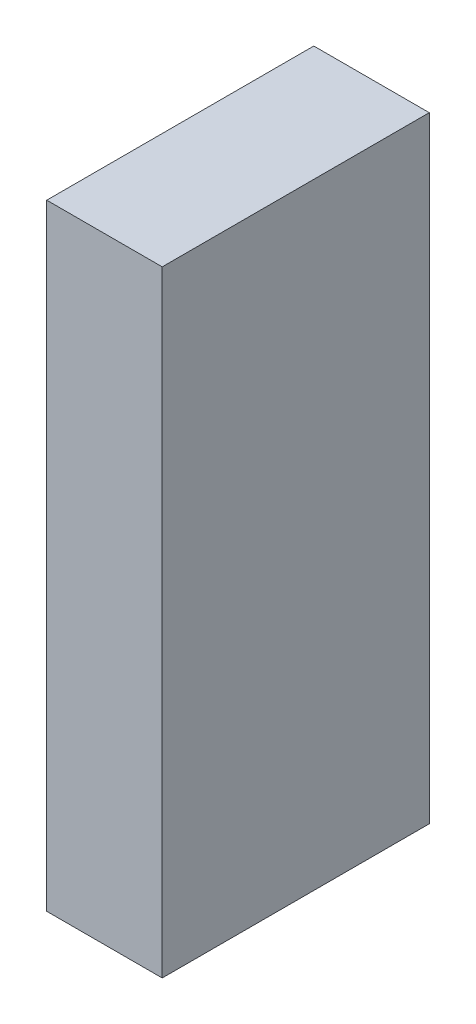
ISO-10303-21;
HEADER;
FILE_DESCRIPTION(('STEP AP214'),'2;1');
FILE_NAME('part.step','',(''),(''),'','','');
FILE_SCHEMA(('AUTOMOTIVE_DESIGN { 1 0 10303 214 1 1 1 1 }'));
ENDSEC;
DATA;
#1=APPLICATION_CONTEXT('core data for automotive mechanical design processes');
#2=APPLICATION_PROTOCOL_DEFINITION('international standard','automotive_design',2000,#1);
#3=PRODUCT_CONTEXT('',#1,'mechanical');
#4=PRODUCT('Part','Part','',(#3));
#5=PRODUCT_RELATED_PRODUCT_CATEGORY('part','',(#4));
#6=PRODUCT_DEFINITION_FORMATION('','',#4);
#7=PRODUCT_DEFINITION_CONTEXT('part definition',#1,'design');
#8=PRODUCT_DEFINITION('design','',#6,#7);
#9=PRODUCT_DEFINITION_SHAPE('','',#8);
#10=(LENGTH_UNIT() NAMED_UNIT(*) SI_UNIT(.MILLI.,.METRE.));
#11=(NAMED_UNIT(*) PLANE_ANGLE_UNIT() SI_UNIT($,.RADIAN.));
#12=(NAMED_UNIT(*) SI_UNIT($,.STERADIAN.) SOLID_ANGLE_UNIT());
#13=UNCERTAINTY_MEASURE_WITH_UNIT(LENGTH_MEASURE(1.E-05),#10,'distance_accuracy_value','');
#14=(GEOMETRIC_REPRESENTATION_CONTEXT(3) GLOBAL_UNCERTAINTY_ASSIGNED_CONTEXT((#13)) GLOBAL_UNIT_ASSIGNED_CONTEXT((#10,
#11,#12)) REPRESENTATION_CONTEXT('',''));
#15=CARTESIAN_POINT('',(0.,0.,0.));
#16=DIRECTION('',(0.,0.,1.));
#17=DIRECTION('',(1.,0.,0.));
#18=AXIS2_PLACEMENT_3D('',#15,#16,#17);
#19=CARTESIAN_POINT('',(-19.05,203.2,44.053125));
#20=DIRECTION('',(1.,0.,0.));
#21=DIRECTION('',(0.,0.,-1.));
#22=AXIS2_PLACEMENT_3D('',#19,#20,#21);
#23=PLANE('',#22);
#24=DIRECTION('',(0.,0.,1.));
#25=VECTOR('',#24,1.);
#26=CARTESIAN_POINT('',(-19.05,0.,44.053125));
#27=LINE('',#26,#25);
#28=CARTESIAN_POINT('',(-19.05,0.,-44.053125));
#29=VERTEX_POINT('',#28);
#30=CARTESIAN_POINT('',(-19.05,0.,44.053125));
#31=VERTEX_POINT('',#30);
#32=EDGE_CURVE('E107',#29,#31,#27,.T.);
#33=ORIENTED_EDGE('',*,*,#32,.T.);
#34=DIRECTION('',(0.,-1.,0.));
#35=VECTOR('',#34,1.);
#36=CARTESIAN_POINT('',(-19.05,203.2,44.053125));
#37=LINE('',#36,#35);
#38=CARTESIAN_POINT('',(-19.05,203.2,44.053125));
#39=VERTEX_POINT('',#38);
#40=EDGE_CURVE('E11',#39,#31,#37,.T.);
#41=ORIENTED_EDGE('',*,*,#40,.F.);
#42=DIRECTION('',(0.,0.,1.));
#43=VECTOR('',#42,1.);
#44=CARTESIAN_POINT('',(-19.05,203.2,44.053125));
#45=LINE('',#44,#43);
#46=CARTESIAN_POINT('',(-19.05,203.2,-44.053125));
#47=VERTEX_POINT('',#46);
#48=EDGE_CURVE('E91',#47,#39,#45,.T.);
#49=ORIENTED_EDGE('',*,*,#48,.F.);
#50=DIRECTION('',(0.,-1.,0.));
#51=VECTOR('',#50,1.);
#52=CARTESIAN_POINT('',(-19.05,203.2,-44.053125));
#53=LINE('',#52,#51);
#54=EDGE_CURVE('E103',#47,#29,#53,.T.);
#55=ORIENTED_EDGE('',*,*,#54,.T.);
#56=EDGE_LOOP('',(#33,#41,#49,#55));
#57=FACE_BOUND('',#56,.T.);
#58=ADVANCED_FACE('F39',(#57),#23,.F.);
#59=CARTESIAN_POINT('',(19.05,203.2,44.053125));
#60=DIRECTION('',(0.,0.,-1.));
#61=DIRECTION('',(-1.,0.,0.));
#62=AXIS2_PLACEMENT_3D('',#59,#60,#61);
#63=PLANE('',#62);
#64=DIRECTION('',(1.,0.,0.));
#65=VECTOR('',#64,1.);
#66=CARTESIAN_POINT('',(19.05,0.,44.053125));
#67=LINE('',#66,#65);
#68=CARTESIAN_POINT('',(19.05,0.,44.053125));
#69=VERTEX_POINT('',#68);
#70=EDGE_CURVE('E96',#31,#69,#67,.T.);
#71=ORIENTED_EDGE('',*,*,#70,.T.);
#72=DIRECTION('',(0.,-1.,0.));
#73=VECTOR('',#72,1.);
#74=CARTESIAN_POINT('',(19.05,203.2,44.053125));
#75=LINE('',#74,#73);
#76=CARTESIAN_POINT('',(19.05,203.2,44.053125));
#77=VERTEX_POINT('',#76);
#78=EDGE_CURVE('E48',#77,#69,#75,.T.);
#79=ORIENTED_EDGE('',*,*,#78,.F.);
#80=DIRECTION('',(1.,0.,0.));
#81=VECTOR('',#80,1.);
#82=CARTESIAN_POINT('',(19.05,203.2,44.053125));
#83=LINE('',#82,#81);
#84=EDGE_CURVE('E86',#39,#77,#83,.T.);
#85=ORIENTED_EDGE('',*,*,#84,.F.);
#86=ORIENTED_EDGE('',*,*,#40,.T.);
#87=EDGE_LOOP('',(#71,#79,#85,#86));
#88=FACE_BOUND('',#87,.T.);
#89=ADVANCED_FACE('F95',(#88),#63,.F.);
#90=CARTESIAN_POINT('',(19.05,203.2,44.053125));
#91=DIRECTION('',(-1.,0.,0.));
#92=DIRECTION('',(0.,0.,1.));
#93=AXIS2_PLACEMENT_3D('',#90,#91,#92);
#94=PLANE('',#93);
#95=DIRECTION('',(0.,0.,-1.));
#96=VECTOR('',#95,1.);
#97=CARTESIAN_POINT('',(19.05,0.,44.053125));
#98=LINE('',#97,#96);
#99=CARTESIAN_POINT('',(19.05,0.,-44.053125));
#100=VERTEX_POINT('',#99);
#101=EDGE_CURVE('E73',#69,#100,#98,.T.);
#102=ORIENTED_EDGE('',*,*,#101,.T.);
#103=DIRECTION('',(0.,-1.,0.));
#104=VECTOR('',#103,1.);
#105=CARTESIAN_POINT('',(19.05,203.2,-44.053125));
#106=LINE('',#105,#104);
#107=CARTESIAN_POINT('',(19.05,203.2,-44.053125));
#108=VERTEX_POINT('',#107);
#109=EDGE_CURVE('E98',#108,#100,#106,.T.);
#110=ORIENTED_EDGE('',*,*,#109,.F.);
#111=DIRECTION('',(0.,0.,-1.));
#112=VECTOR('',#111,1.);
#113=CARTESIAN_POINT('',(19.05,203.2,44.053125));
#114=LINE('',#113,#112);
#115=EDGE_CURVE('E89',#77,#108,#114,.T.);
#116=ORIENTED_EDGE('',*,*,#115,.F.);
#117=ORIENTED_EDGE('',*,*,#78,.T.);
#118=EDGE_LOOP('',(#102,#110,#116,#117));
#119=FACE_BOUND('',#118,.T.);
#120=ADVANCED_FACE('F99',(#119),#94,.F.);
#121=CARTESIAN_POINT('',(19.05,203.2,-44.053125));
#122=DIRECTION('',(0.,0.,1.));
#123=DIRECTION('',(1.,0.,0.));
#124=AXIS2_PLACEMENT_3D('',#121,#122,#123);
#125=PLANE('',#124);
#126=DIRECTION('',(-1.,0.,0.));
#127=VECTOR('',#126,1.);
#128=CARTESIAN_POINT('',(19.05,0.,-44.053125));
#129=LINE('',#128,#127);
#130=EDGE_CURVE('E79',#100,#29,#129,.T.);
#131=ORIENTED_EDGE('',*,*,#130,.T.);
#132=ORIENTED_EDGE('',*,*,#54,.F.);
#133=DIRECTION('',(-1.,0.,0.));
#134=VECTOR('',#133,1.);
#135=CARTESIAN_POINT('',(19.05,203.2,-44.053125));
#136=LINE('',#135,#134);
#137=EDGE_CURVE('E56',#108,#47,#136,.T.);
#138=ORIENTED_EDGE('',*,*,#137,.F.);
#139=ORIENTED_EDGE('',*,*,#109,.T.);
#140=EDGE_LOOP('',(#131,#132,#138,#139));
#141=FACE_BOUND('',#140,.T.);
#142=ADVANCED_FACE('F120',(#141),#125,.F.);
#143=CARTESIAN_POINT('',(0.,203.2,0.));
#144=DIRECTION('',(0.,1.,0.));
#145=DIRECTION('',(0.,0.,1.));
#146=AXIS2_PLACEMENT_3D('',#143,#144,#145);
#147=PLANE('',#146);
#148=ORIENTED_EDGE('',*,*,#48,.T.);
#149=ORIENTED_EDGE('',*,*,#84,.T.);
#150=ORIENTED_EDGE('',*,*,#115,.T.);
#151=ORIENTED_EDGE('',*,*,#137,.T.);
#152=EDGE_LOOP('',(#148,#149,#150,#151));
#153=FACE_BOUND('',#152,.T.);
#154=ADVANCED_FACE('F87',(#153),#147,.T.);
#155=CARTESIAN_POINT('',(0.,0.,0.));
#156=DIRECTION('',(0.,1.,0.));
#157=DIRECTION('',(0.,0.,1.));
#158=AXIS2_PLACEMENT_3D('',#155,#156,#157);
#159=PLANE('',#158);
#160=ORIENTED_EDGE('',*,*,#32,.F.);
#161=ORIENTED_EDGE('',*,*,#130,.F.);
#162=ORIENTED_EDGE('',*,*,#101,.F.);
#163=ORIENTED_EDGE('',*,*,#70,.F.);
#164=EDGE_LOOP('',(#160,#161,#162,#163));
#165=FACE_BOUND('',#164,.T.);
#166=ADVANCED_FACE('F123',(#165),#159,.F.);
#167=CLOSED_SHELL('',(#58,#89,#120,#142,#154,#166));
#168=MANIFOLD_SOLID_BREP('B2',#167);
#169=ADVANCED_BREP_SHAPE_REPRESENTATION('',(#18,#168),#14);
#170=SHAPE_DEFINITION_REPRESENTATION(#9,#169);
ENDSEC;
END-ISO-10303-21;
